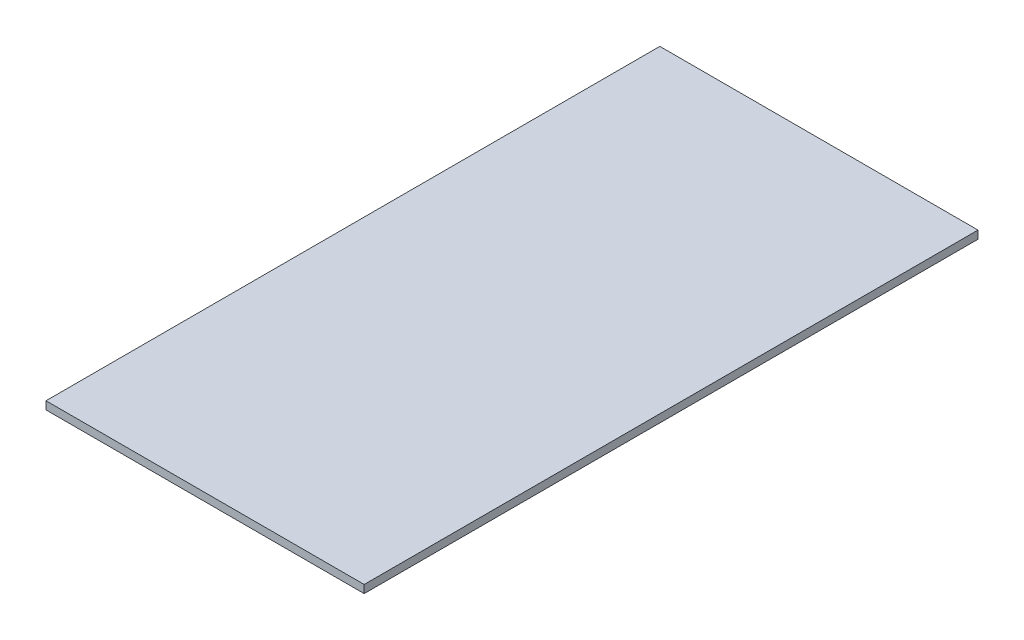
ISO-10303-21;
HEADER;
FILE_DESCRIPTION(('STEP AP214'),'2;1');
FILE_NAME('part.step','',(''),(''),'','','');
FILE_SCHEMA(('AUTOMOTIVE_DESIGN { 1 0 10303 214 1 1 1 1 }'));
ENDSEC;
DATA;
#1=APPLICATION_CONTEXT('core data for automotive mechanical design processes');
#2=APPLICATION_PROTOCOL_DEFINITION('international standard','automotive_design',2000,#1);
#3=PRODUCT_CONTEXT('',#1,'mechanical');
#4=PRODUCT('Part','Part','',(#3));
#5=PRODUCT_RELATED_PRODUCT_CATEGORY('part','',(#4));
#6=PRODUCT_DEFINITION_FORMATION('','',#4);
#7=PRODUCT_DEFINITION_CONTEXT('part definition',#1,'design');
#8=PRODUCT_DEFINITION('design','',#6,#7);
#9=PRODUCT_DEFINITION_SHAPE('','',#8);
#10=(LENGTH_UNIT() NAMED_UNIT(*) SI_UNIT(.MILLI.,.METRE.));
#11=(NAMED_UNIT(*) PLANE_ANGLE_UNIT() SI_UNIT($,.RADIAN.));
#12=(NAMED_UNIT(*) SI_UNIT($,.STERADIAN.) SOLID_ANGLE_UNIT());
#13=UNCERTAINTY_MEASURE_WITH_UNIT(LENGTH_MEASURE(1.E-05),#10,'distance_accuracy_value','');
#14=(GEOMETRIC_REPRESENTATION_CONTEXT(3) GLOBAL_UNCERTAINTY_ASSIGNED_CONTEXT((#13)) GLOBAL_UNIT_ASSIGNED_CONTEXT((#10,
#11,#12)) REPRESENTATION_CONTEXT('',''));
#15=CARTESIAN_POINT('',(0.,0.,0.));
#16=DIRECTION('',(0.,0.,1.));
#17=DIRECTION('',(1.,0.,0.));
#18=AXIS2_PLACEMENT_3D('',#15,#16,#17);
#19=CARTESIAN_POINT('',(60.,3.,115.75));
#20=DIRECTION('',(-1.,0.,0.));
#21=DIRECTION('',(0.,0.,1.));
#22=AXIS2_PLACEMENT_3D('',#19,#20,#21);
#23=PLANE('',#22);
#24=DIRECTION('',(0.,0.,-1.));
#25=VECTOR('',#24,1.);
#26=CARTESIAN_POINT('',(60.,0.,115.75));
#27=LINE('',#26,#25);
#28=CARTESIAN_POINT('',(60.,0.,115.75));
#29=VERTEX_POINT('',#28);
#30=CARTESIAN_POINT('',(60.,0.,-115.75));
#31=VERTEX_POINT('',#30);
#32=EDGE_CURVE('E113',#29,#31,#27,.T.);
#33=ORIENTED_EDGE('',*,*,#32,.T.);
#34=DIRECTION('',(0.,-1.,0.));
#35=VECTOR('',#34,1.);
#36=CARTESIAN_POINT('',(60.,3.,-115.75));
#37=LINE('',#36,#35);
#38=CARTESIAN_POINT('',(60.,3.,-115.75));
#39=VERTEX_POINT('',#38);
#40=EDGE_CURVE('E11',#39,#31,#37,.T.);
#41=ORIENTED_EDGE('',*,*,#40,.F.);
#42=DIRECTION('',(0.,0.,-1.));
#43=VECTOR('',#42,1.);
#44=CARTESIAN_POINT('',(60.,3.,115.75));
#45=LINE('',#44,#43);
#46=CARTESIAN_POINT('',(60.,3.,115.75));
#47=VERTEX_POINT('',#46);
#48=EDGE_CURVE('E97',#47,#39,#45,.T.);
#49=ORIENTED_EDGE('',*,*,#48,.F.);
#50=DIRECTION('',(0.,-1.,0.));
#51=VECTOR('',#50,1.);
#52=CARTESIAN_POINT('',(60.,3.,115.75));
#53=LINE('',#52,#51);
#54=EDGE_CURVE('E109',#47,#29,#53,.T.);
#55=ORIENTED_EDGE('',*,*,#54,.T.);
#56=EDGE_LOOP('',(#33,#41,#49,#55));
#57=FACE_BOUND('',#56,.T.);
#58=ADVANCED_FACE('F45',(#57),#23,.F.);
#59=CARTESIAN_POINT('',(-60.,3.,-115.75));
#60=DIRECTION('',(0.,0.,1.));
#61=DIRECTION('',(1.,0.,0.));
#62=AXIS2_PLACEMENT_3D('',#59,#60,#61);
#63=PLANE('',#62);
#64=DIRECTION('',(-1.,0.,0.));
#65=VECTOR('',#64,1.);
#66=CARTESIAN_POINT('',(-60.,0.,-115.75));
#67=LINE('',#66,#65);
#68=CARTESIAN_POINT('',(-60.,0.,-115.75));
#69=VERTEX_POINT('',#68);
#70=EDGE_CURVE('E102',#31,#69,#67,.T.);
#71=ORIENTED_EDGE('',*,*,#70,.T.);
#72=DIRECTION('',(0.,-1.,0.));
#73=VECTOR('',#72,1.);
#74=CARTESIAN_POINT('',(-60.,3.,-115.75));
#75=LINE('',#74,#73);
#76=CARTESIAN_POINT('',(-60.,3.,-115.75));
#77=VERTEX_POINT('',#76);
#78=EDGE_CURVE('E54',#77,#69,#75,.T.);
#79=ORIENTED_EDGE('',*,*,#78,.F.);
#80=DIRECTION('',(-1.,0.,0.));
#81=VECTOR('',#80,1.);
#82=CARTESIAN_POINT('',(-60.,3.,-115.75));
#83=LINE('',#82,#81);
#84=EDGE_CURVE('E92',#39,#77,#83,.T.);
#85=ORIENTED_EDGE('',*,*,#84,.F.);
#86=ORIENTED_EDGE('',*,*,#40,.T.);
#87=EDGE_LOOP('',(#71,#79,#85,#86));
#88=FACE_BOUND('',#87,.T.);
#89=ADVANCED_FACE('F101',(#88),#63,.F.);
#90=CARTESIAN_POINT('',(-60.,3.,115.75));
#91=DIRECTION('',(1.,0.,0.));
#92=DIRECTION('',(0.,0.,-1.));
#93=AXIS2_PLACEMENT_3D('',#90,#91,#92);
#94=PLANE('',#93);
#95=DIRECTION('',(0.,0.,1.));
#96=VECTOR('',#95,1.);
#97=CARTESIAN_POINT('',(-60.,0.,115.75));
#98=LINE('',#97,#96);
#99=CARTESIAN_POINT('',(-60.,0.,115.75));
#100=VERTEX_POINT('',#99);
#101=EDGE_CURVE('E79',#69,#100,#98,.T.);
#102=ORIENTED_EDGE('',*,*,#101,.T.);
#103=DIRECTION('',(0.,-1.,0.));
#104=VECTOR('',#103,1.);
#105=CARTESIAN_POINT('',(-60.,3.,115.75));
#106=LINE('',#105,#104);
#107=CARTESIAN_POINT('',(-60.,3.,115.75));
#108=VERTEX_POINT('',#107);
#109=EDGE_CURVE('E104',#108,#100,#106,.T.);
#110=ORIENTED_EDGE('',*,*,#109,.F.);
#111=DIRECTION('',(0.,0.,1.));
#112=VECTOR('',#111,1.);
#113=CARTESIAN_POINT('',(-60.,3.,115.75));
#114=LINE('',#113,#112);
#115=EDGE_CURVE('E95',#77,#108,#114,.T.);
#116=ORIENTED_EDGE('',*,*,#115,.F.);
#117=ORIENTED_EDGE('',*,*,#78,.T.);
#118=EDGE_LOOP('',(#102,#110,#116,#117));
#119=FACE_BOUND('',#118,.T.);
#120=ADVANCED_FACE('F105',(#119),#94,.F.);
#121=CARTESIAN_POINT('',(-60.,3.,115.75));
#122=DIRECTION('',(0.,0.,-1.));
#123=DIRECTION('',(-1.,0.,0.));
#124=AXIS2_PLACEMENT_3D('',#121,#122,#123);
#125=PLANE('',#124);
#126=DIRECTION('',(1.,0.,0.));
#127=VECTOR('',#126,1.);
#128=CARTESIAN_POINT('',(-60.,0.,115.75));
#129=LINE('',#128,#127);
#130=EDGE_CURVE('E85',#100,#29,#129,.T.);
#131=ORIENTED_EDGE('',*,*,#130,.T.);
#132=ORIENTED_EDGE('',*,*,#54,.F.);
#133=DIRECTION('',(1.,0.,0.));
#134=VECTOR('',#133,1.);
#135=CARTESIAN_POINT('',(-60.,3.,115.75));
#136=LINE('',#135,#134);
#137=EDGE_CURVE('E62',#108,#47,#136,.T.);
#138=ORIENTED_EDGE('',*,*,#137,.F.);
#139=ORIENTED_EDGE('',*,*,#109,.T.);
#140=EDGE_LOOP('',(#131,#132,#138,#139));
#141=FACE_BOUND('',#140,.T.);
#142=ADVANCED_FACE('F126',(#141),#125,.F.);
#143=CARTESIAN_POINT('',(0.,3.,0.));
#144=DIRECTION('',(0.,-1.,0.));
#145=DIRECTION('',(0.,0.,-1.));
#146=AXIS2_PLACEMENT_3D('',#143,#144,#145);
#147=PLANE('',#146);
#148=ORIENTED_EDGE('',*,*,#48,.T.);
#149=ORIENTED_EDGE('',*,*,#84,.T.);
#150=ORIENTED_EDGE('',*,*,#115,.T.);
#151=ORIENTED_EDGE('',*,*,#137,.T.);
#152=EDGE_LOOP('',(#148,#149,#150,#151));
#153=FACE_BOUND('',#152,.T.);
#154=ADVANCED_FACE('F93',(#153),#147,.F.);
#155=CARTESIAN_POINT('',(0.,0.,0.));
#156=DIRECTION('',(0.,-1.,0.));
#157=DIRECTION('',(0.,0.,-1.));
#158=AXIS2_PLACEMENT_3D('',#155,#156,#157);
#159=PLANE('',#158);
#160=ORIENTED_EDGE('',*,*,#32,.F.);
#161=ORIENTED_EDGE('',*,*,#130,.F.);
#162=ORIENTED_EDGE('',*,*,#101,.F.);
#163=ORIENTED_EDGE('',*,*,#70,.F.);
#164=EDGE_LOOP('',(#160,#161,#162,#163));
#165=FACE_BOUND('',#164,.T.);
#166=ADVANCED_FACE('F129',(#165),#159,.T.);
#167=CLOSED_SHELL('',(#58,#89,#120,#142,#154,#166));
#168=MANIFOLD_SOLID_BREP('B2',#167);
#169=ADVANCED_BREP_SHAPE_REPRESENTATION('',(#18,#168),#14);
#170=SHAPE_DEFINITION_REPRESENTATION(#9,#169);
ENDSEC;
END-ISO-10303-21;
